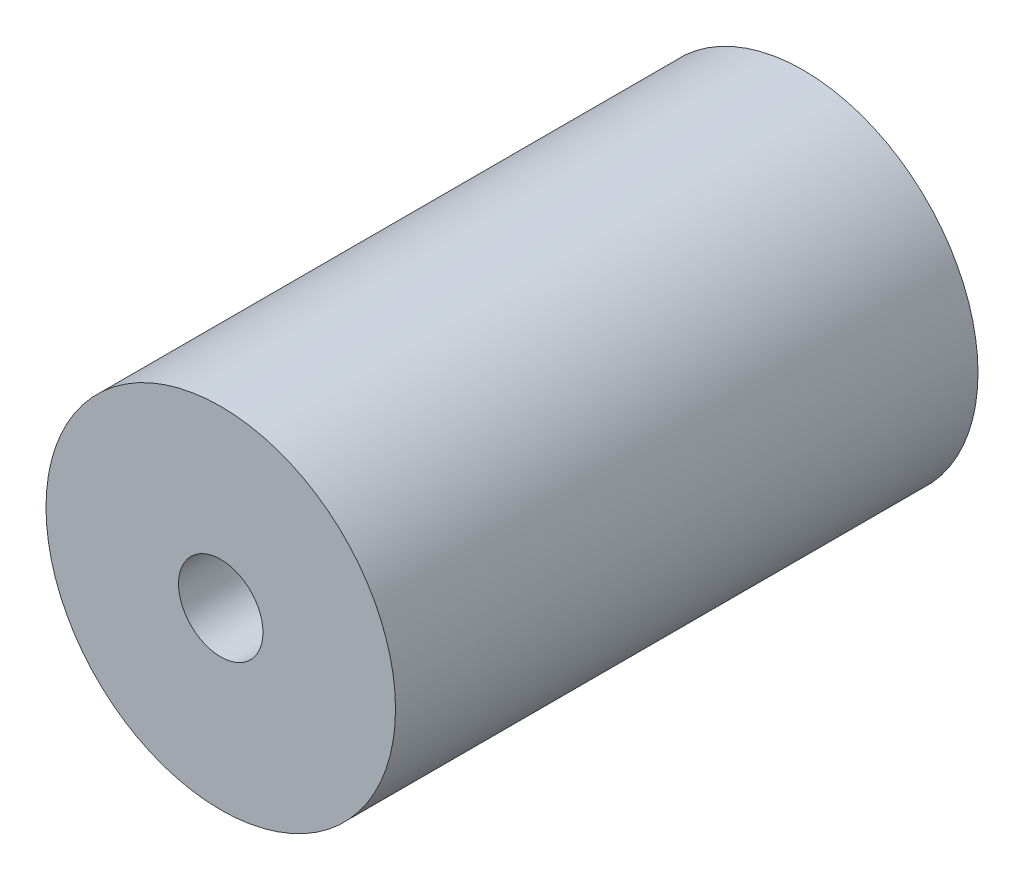
ISO-10303-21;
HEADER;
FILE_DESCRIPTION(('STEP AP214'),'2;1');
FILE_NAME('part.step','',(''),(''),'','','');
FILE_SCHEMA(('AUTOMOTIVE_DESIGN { 1 0 10303 214 1 1 1 1 }'));
ENDSEC;
DATA;
#1=APPLICATION_CONTEXT('core data for automotive mechanical design processes');
#2=APPLICATION_PROTOCOL_DEFINITION('international standard','automotive_design',2000,#1);
#3=PRODUCT_CONTEXT('',#1,'mechanical');
#4=PRODUCT('Part','Part','',(#3));
#5=PRODUCT_RELATED_PRODUCT_CATEGORY('part','',(#4));
#6=PRODUCT_DEFINITION_FORMATION('','',#4);
#7=PRODUCT_DEFINITION_CONTEXT('part definition',#1,'design');
#8=PRODUCT_DEFINITION('design','',#6,#7);
#9=PRODUCT_DEFINITION_SHAPE('','',#8);
#10=(LENGTH_UNIT() NAMED_UNIT(*) SI_UNIT(.MILLI.,.METRE.));
#11=(NAMED_UNIT(*) PLANE_ANGLE_UNIT() SI_UNIT($,.RADIAN.));
#12=(NAMED_UNIT(*) SI_UNIT($,.STERADIAN.) SOLID_ANGLE_UNIT());
#13=UNCERTAINTY_MEASURE_WITH_UNIT(LENGTH_MEASURE(1.E-05),#10,'distance_accuracy_value','');
#14=(GEOMETRIC_REPRESENTATION_CONTEXT(3) GLOBAL_UNCERTAINTY_ASSIGNED_CONTEXT((#13)) GLOBAL_UNIT_ASSIGNED_CONTEXT((#10,
#11,#12)) REPRESENTATION_CONTEXT('',''));
#15=CARTESIAN_POINT('',(0.,0.,0.));
#16=DIRECTION('',(0.,0.,1.));
#17=DIRECTION('',(1.,0.,0.));
#18=AXIS2_PLACEMENT_3D('',#15,#16,#17);
#19=CARTESIAN_POINT('',(0.,0.,20.));
#20=DIRECTION('',(0.,0.,1.));
#21=DIRECTION('',(1.,0.,0.));
#22=AXIS2_PLACEMENT_3D('',#19,#20,#21);
#23=PLANE('',#22);
#24=CARTESIAN_POINT('',(0.,0.,20.));
#25=DIRECTION('',(0.,0.,1.));
#26=DIRECTION('',(1.,0.,0.));
#27=AXIS2_PLACEMENT_3D('',#24,#25,#26);
#28=CIRCLE('',#27,6.);
#29=CARTESIAN_POINT('',(6.,0.,20.));
#30=VERTEX_POINT('',#29);
#31=EDGE_CURVE('E10',#30,#30,#28,.T.);
#32=ORIENTED_EDGE('',*,*,#31,.T.);
#33=EDGE_LOOP('',(#32));
#34=FACE_BOUND('',#33,.T.);
#35=CARTESIAN_POINT('',(0.,0.,20.));
#36=DIRECTION('',(0.,0.,1.));
#37=DIRECTION('',(1.,0.,0.));
#38=AXIS2_PLACEMENT_3D('',#35,#36,#37);
#39=CIRCLE('',#38,1.45);
#40=CARTESIAN_POINT('',(1.45,0.,20.));
#41=VERTEX_POINT('',#40);
#42=EDGE_CURVE('E43',#41,#41,#39,.T.);
#43=ORIENTED_EDGE('',*,*,#42,.F.);
#44=EDGE_LOOP('',(#43));
#45=FACE_BOUND('',#44,.T.);
#46=ADVANCED_FACE('F32',(#34,#45),#23,.T.);
#47=CARTESIAN_POINT('',(0.,0.,0.));
#48=DIRECTION('',(0.,0.,1.));
#49=DIRECTION('',(1.,0.,0.));
#50=AXIS2_PLACEMENT_3D('',#47,#48,#49);
#51=PLANE('',#50);
#52=CARTESIAN_POINT('',(0.,0.,0.));
#53=DIRECTION('',(0.,0.,1.));
#54=DIRECTION('',(1.,0.,0.));
#55=AXIS2_PLACEMENT_3D('',#52,#53,#54);
#56=CIRCLE('',#55,6.);
#57=CARTESIAN_POINT('',(6.,0.,0.));
#58=VERTEX_POINT('',#57);
#59=EDGE_CURVE('E36',#58,#58,#56,.T.);
#60=ORIENTED_EDGE('',*,*,#59,.F.);
#61=EDGE_LOOP('',(#60));
#62=FACE_BOUND('',#61,.T.);
#63=CARTESIAN_POINT('',(0.,0.,0.));
#64=DIRECTION('',(0.,0.,1.));
#65=DIRECTION('',(1.,0.,0.));
#66=AXIS2_PLACEMENT_3D('',#63,#64,#65);
#67=CIRCLE('',#66,1.45);
#68=CARTESIAN_POINT('',(1.45,0.,0.));
#69=VERTEX_POINT('',#68);
#70=EDGE_CURVE('E45',#69,#69,#67,.T.);
#71=ORIENTED_EDGE('',*,*,#70,.T.);
#72=EDGE_LOOP('',(#71));
#73=FACE_BOUND('',#72,.T.);
#74=ADVANCED_FACE('F55',(#62,#73),#51,.F.);
#75=CARTESIAN_POINT('',(0.,0.,20.));
#76=DIRECTION('',(0.,0.,-1.));
#77=DIRECTION('',(-1.,0.,0.));
#78=AXIS2_PLACEMENT_3D('',#75,#76,#77);
#79=CYLINDRICAL_SURFACE('',#78,6.);
#80=ORIENTED_EDGE('',*,*,#31,.F.);
#81=EDGE_LOOP('',(#80));
#82=FACE_BOUND('',#81,.T.);
#83=ORIENTED_EDGE('',*,*,#59,.T.);
#84=EDGE_LOOP('',(#83));
#85=FACE_BOUND('',#84,.T.);
#86=ADVANCED_FACE('F34',(#82,#85),#79,.T.);
#87=CARTESIAN_POINT('',(0.,0.,20.));
#88=DIRECTION('',(0.,0.,-1.));
#89=DIRECTION('',(-1.,0.,0.));
#90=AXIS2_PLACEMENT_3D('',#87,#88,#89);
#91=CYLINDRICAL_SURFACE('',#90,1.45);
#92=ORIENTED_EDGE('',*,*,#42,.T.);
#93=EDGE_LOOP('',(#92));
#94=FACE_BOUND('',#93,.T.);
#95=ORIENTED_EDGE('',*,*,#70,.F.);
#96=EDGE_LOOP('',(#95));
#97=FACE_BOUND('',#96,.T.);
#98=ADVANCED_FACE('F51',(#94,#97),#91,.F.);
#99=CLOSED_SHELL('',(#46,#74,#86,#98));
#100=MANIFOLD_SOLID_BREP('B2',#99);
#101=ADVANCED_BREP_SHAPE_REPRESENTATION('',(#18,#100),#14);
#102=SHAPE_DEFINITION_REPRESENTATION(#9,#101);
ENDSEC;
END-ISO-10303-21;
